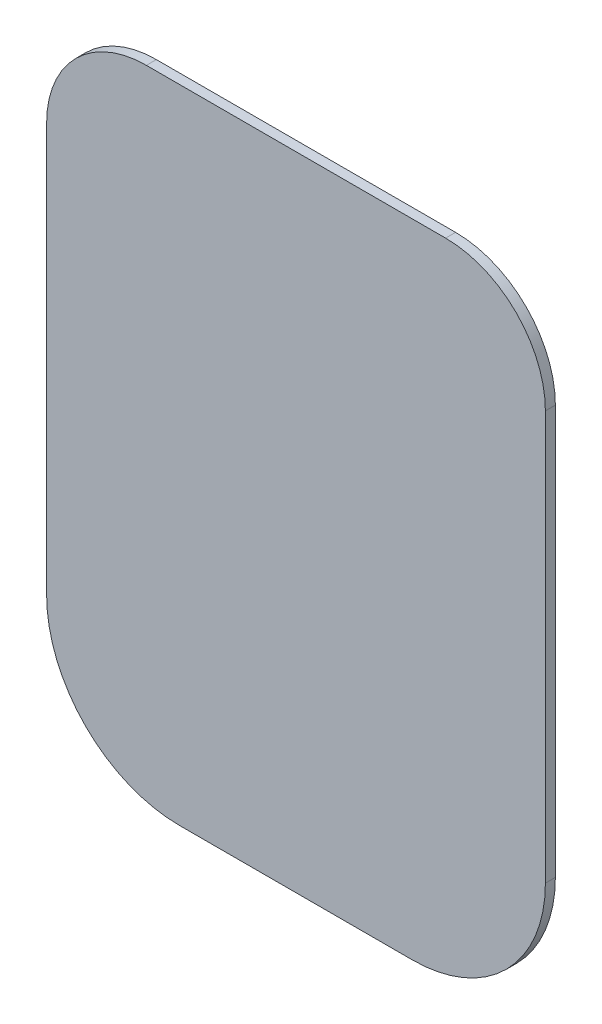
ISO-10303-21;
HEADER;
FILE_DESCRIPTION(('STEP AP214'),'2;1');
FILE_NAME('part.step','',(''),(''),'','','');
FILE_SCHEMA(('AUTOMOTIVE_DESIGN { 1 0 10303 214 1 1 1 1 }'));
ENDSEC;
DATA;
#1=APPLICATION_CONTEXT('core data for automotive mechanical design processes');
#2=APPLICATION_PROTOCOL_DEFINITION('international standard','automotive_design',2000,#1);
#3=PRODUCT_CONTEXT('',#1,'mechanical');
#4=PRODUCT('Part','Part','',(#3));
#5=PRODUCT_RELATED_PRODUCT_CATEGORY('part','',(#4));
#6=PRODUCT_DEFINITION_FORMATION('','',#4);
#7=PRODUCT_DEFINITION_CONTEXT('part definition',#1,'design');
#8=PRODUCT_DEFINITION('design','',#6,#7);
#9=PRODUCT_DEFINITION_SHAPE('','',#8);
#10=(LENGTH_UNIT() NAMED_UNIT(*) SI_UNIT(.MILLI.,.METRE.));
#11=(NAMED_UNIT(*) PLANE_ANGLE_UNIT() SI_UNIT($,.RADIAN.));
#12=(NAMED_UNIT(*) SI_UNIT($,.STERADIAN.) SOLID_ANGLE_UNIT());
#13=UNCERTAINTY_MEASURE_WITH_UNIT(LENGTH_MEASURE(1.E-05),#10,'distance_accuracy_value','');
#14=(GEOMETRIC_REPRESENTATION_CONTEXT(3) GLOBAL_UNCERTAINTY_ASSIGNED_CONTEXT((#13)) GLOBAL_UNIT_ASSIGNED_CONTEXT((#10,
#11,#12)) REPRESENTATION_CONTEXT('',''));
#15=CARTESIAN_POINT('',(0.,0.,0.));
#16=DIRECTION('',(0.,0.,1.));
#17=DIRECTION('',(1.,0.,0.));
#18=AXIS2_PLACEMENT_3D('',#15,#16,#17);
#19=CARTESIAN_POINT('',(-45.,66.5,3.));
#20=DIRECTION('',(0.,0.,-1.));
#21=DIRECTION('',(-1.,0.,0.));
#22=AXIS2_PLACEMENT_3D('',#19,#20,#21);
#23=CYLINDRICAL_SURFACE('',#22,30.);
#24=CARTESIAN_POINT('',(-45.,66.5,0.));
#25=DIRECTION('',(0.,0.,1.));
#26=DIRECTION('',(-1.,0.,0.));
#27=AXIS2_PLACEMENT_3D('',#24,#25,#26);
#28=CIRCLE('',#27,30.);
#29=CARTESIAN_POINT('',(-45.,96.5,0.));
#30=VERTEX_POINT('',#29);
#31=CARTESIAN_POINT('',(-75.,66.5,0.));
#32=VERTEX_POINT('',#31);
#33=EDGE_CURVE('E133',#30,#32,#28,.T.);
#34=ORIENTED_EDGE('',*,*,#33,.T.);
#35=DIRECTION('',(0.,0.,-1.));
#36=VECTOR('',#35,1.);
#37=CARTESIAN_POINT('',(-75.,66.5,3.));
#38=LINE('',#37,#36);
#39=CARTESIAN_POINT('',(-75.,66.5,3.));
#40=VERTEX_POINT('',#39);
#41=EDGE_CURVE('E11',#40,#32,#38,.T.);
#42=ORIENTED_EDGE('',*,*,#41,.F.);
#43=CARTESIAN_POINT('',(-45.,66.5,3.));
#44=DIRECTION('',(0.,0.,1.));
#45=DIRECTION('',(-1.,0.,0.));
#46=AXIS2_PLACEMENT_3D('',#43,#44,#45);
#47=CIRCLE('',#46,30.);
#48=CARTESIAN_POINT('',(-45.,96.5,3.));
#49=VERTEX_POINT('',#48);
#50=EDGE_CURVE('E148',#49,#40,#47,.T.);
#51=ORIENTED_EDGE('',*,*,#50,.F.);
#52=DIRECTION('',(0.,0.,-1.));
#53=VECTOR('',#52,1.);
#54=CARTESIAN_POINT('',(-45.,96.5,3.));
#55=LINE('',#54,#53);
#56=EDGE_CURVE('E129',#49,#30,#55,.T.);
#57=ORIENTED_EDGE('',*,*,#56,.T.);
#58=EDGE_LOOP('',(#34,#42,#51,#57));
#59=FACE_BOUND('',#58,.T.);
#60=ADVANCED_FACE('F37',(#59),#23,.T.);
#61=CARTESIAN_POINT('',(-75.,66.5,3.));
#62=DIRECTION('',(1.,0.,0.));
#63=DIRECTION('',(0.,1.,0.));
#64=AXIS2_PLACEMENT_3D('',#61,#62,#63);
#65=PLANE('',#64);
#66=DIRECTION('',(0.,-1.,0.));
#67=VECTOR('',#66,1.);
#68=CARTESIAN_POINT('',(-75.,66.5,0.));
#69=LINE('',#68,#67);
#70=CARTESIAN_POINT('',(-75.,-56.5,0.));
#71=VERTEX_POINT('',#70);
#72=EDGE_CURVE('E136',#32,#71,#69,.T.);
#73=ORIENTED_EDGE('',*,*,#72,.T.);
#74=DIRECTION('',(0.,0.,-1.));
#75=VECTOR('',#74,1.);
#76=CARTESIAN_POINT('',(-75.,-56.5,3.));
#77=LINE('',#76,#75);
#78=CARTESIAN_POINT('',(-75.,-56.5,3.));
#79=VERTEX_POINT('',#78);
#80=EDGE_CURVE('E45',#79,#71,#77,.T.);
#81=ORIENTED_EDGE('',*,*,#80,.F.);
#82=DIRECTION('',(0.,-1.,0.));
#83=VECTOR('',#82,1.);
#84=CARTESIAN_POINT('',(-75.,66.5,3.));
#85=LINE('',#84,#83);
#86=EDGE_CURVE('E96',#40,#79,#85,.T.);
#87=ORIENTED_EDGE('',*,*,#86,.F.);
#88=ORIENTED_EDGE('',*,*,#41,.T.);
#89=EDGE_LOOP('',(#73,#81,#87,#88));
#90=FACE_BOUND('',#89,.T.);
#91=ADVANCED_FACE('F182',(#90),#65,.F.);
#92=CARTESIAN_POINT('',(-35.,-56.5,3.));
#93=DIRECTION('',(0.,0.,-1.));
#94=DIRECTION('',(-1.,0.,0.));
#95=AXIS2_PLACEMENT_3D('',#92,#93,#94);
#96=CYLINDRICAL_SURFACE('',#95,40.);
#97=CARTESIAN_POINT('',(-35.,-56.5,0.));
#98=DIRECTION('',(0.,0.,1.));
#99=DIRECTION('',(1.,0.,0.));
#100=AXIS2_PLACEMENT_3D('',#97,#98,#99);
#101=CIRCLE('',#100,40.);
#102=CARTESIAN_POINT('',(-35.,-96.5,0.));
#103=VERTEX_POINT('',#102);
#104=EDGE_CURVE('E138',#71,#103,#101,.T.);
#105=ORIENTED_EDGE('',*,*,#104,.T.);
#106=DIRECTION('',(0.,0.,-1.));
#107=VECTOR('',#106,1.);
#108=CARTESIAN_POINT('',(-35.,-96.5,3.));
#109=LINE('',#108,#107);
#110=CARTESIAN_POINT('',(-35.,-96.5,3.));
#111=VERTEX_POINT('',#110);
#112=EDGE_CURVE('E155',#111,#103,#109,.T.);
#113=ORIENTED_EDGE('',*,*,#112,.F.);
#114=CARTESIAN_POINT('',(-35.,-56.5,3.));
#115=DIRECTION('',(0.,0.,1.));
#116=DIRECTION('',(1.,0.,0.));
#117=AXIS2_PLACEMENT_3D('',#114,#115,#116);
#118=CIRCLE('',#117,40.);
#119=EDGE_CURVE('E163',#79,#111,#118,.T.);
#120=ORIENTED_EDGE('',*,*,#119,.F.);
#121=ORIENTED_EDGE('',*,*,#80,.T.);
#122=EDGE_LOOP('',(#105,#113,#120,#121));
#123=FACE_BOUND('',#122,.T.);
#124=ADVANCED_FACE('F161',(#123),#96,.T.);
#125=CARTESIAN_POINT('',(0.500000000000024,-96.5,3.));
#126=DIRECTION('',(0.,1.,0.));
#127=DIRECTION('',(0.,0.,1.));
#128=AXIS2_PLACEMENT_3D('',#125,#126,#127);
#129=PLANE('',#128);
#130=DIRECTION('',(1.,0.,0.));
#131=VECTOR('',#130,1.);
#132=CARTESIAN_POINT('',(0.500000000000024,-96.5,0.));
#133=LINE('',#132,#131);
#134=CARTESIAN_POINT('',(35.,-96.5,0.));
#135=VERTEX_POINT('',#134);
#136=EDGE_CURVE('E141',#103,#135,#133,.T.);
#137=ORIENTED_EDGE('',*,*,#136,.T.);
#138=DIRECTION('',(0.,0.,-1.));
#139=VECTOR('',#138,1.);
#140=CARTESIAN_POINT('',(35.,-96.5,3.));
#141=LINE('',#140,#139);
#142=CARTESIAN_POINT('',(35.,-96.5,3.));
#143=VERTEX_POINT('',#142);
#144=EDGE_CURVE('E152',#143,#135,#141,.T.);
#145=ORIENTED_EDGE('',*,*,#144,.F.);
#146=DIRECTION('',(1.,0.,0.));
#147=VECTOR('',#146,1.);
#148=CARTESIAN_POINT('',(-35.,-96.5,3.));
#149=LINE('',#148,#147);
#150=EDGE_CURVE('E174',#111,#143,#149,.T.);
#151=ORIENTED_EDGE('',*,*,#150,.F.);
#152=ORIENTED_EDGE('',*,*,#112,.T.);
#153=EDGE_LOOP('',(#137,#145,#151,#152));
#154=FACE_BOUND('',#153,.T.);
#155=ADVANCED_FACE('F170',(#154),#129,.F.);
#156=CARTESIAN_POINT('',(35.,-56.5,3.));
#157=DIRECTION('',(0.,0.,-1.));
#158=DIRECTION('',(-1.,0.,0.));
#159=AXIS2_PLACEMENT_3D('',#156,#157,#158);
#160=CYLINDRICAL_SURFACE('',#159,40.);
#161=CARTESIAN_POINT('',(35.,-56.5,0.));
#162=DIRECTION('',(0.,0.,1.));
#163=DIRECTION('',(1.,0.,0.));
#164=AXIS2_PLACEMENT_3D('',#161,#162,#163);
#165=CIRCLE('',#164,40.);
#166=CARTESIAN_POINT('',(75.,-56.5,0.));
#167=VERTEX_POINT('',#166);
#168=EDGE_CURVE('E143',#135,#167,#165,.T.);
#169=ORIENTED_EDGE('',*,*,#168,.T.);
#170=DIRECTION('',(0.,0.,-1.));
#171=VECTOR('',#170,1.);
#172=CARTESIAN_POINT('',(75.,-56.5,3.));
#173=LINE('',#172,#171);
#174=CARTESIAN_POINT('',(75.,-56.5,3.));
#175=VERTEX_POINT('',#174);
#176=EDGE_CURVE('E124',#175,#167,#173,.T.);
#177=ORIENTED_EDGE('',*,*,#176,.F.);
#178=CARTESIAN_POINT('',(35.,-56.5,3.));
#179=DIRECTION('',(0.,0.,1.));
#180=DIRECTION('',(1.,0.,0.));
#181=AXIS2_PLACEMENT_3D('',#178,#179,#180);
#182=CIRCLE('',#181,40.);
#183=EDGE_CURVE('E115',#143,#175,#182,.T.);
#184=ORIENTED_EDGE('',*,*,#183,.F.);
#185=ORIENTED_EDGE('',*,*,#144,.T.);
#186=EDGE_LOOP('',(#169,#177,#184,#185));
#187=FACE_BOUND('',#186,.T.);
#188=ADVANCED_FACE('F173',(#187),#160,.T.);
#189=CARTESIAN_POINT('',(75.,66.5,3.));
#190=DIRECTION('',(-1.,0.,0.));
#191=DIRECTION('',(0.,-1.,0.));
#192=AXIS2_PLACEMENT_3D('',#189,#190,#191);
#193=PLANE('',#192);
#194=DIRECTION('',(0.,1.,0.));
#195=VECTOR('',#194,1.);
#196=CARTESIAN_POINT('',(75.,66.5,0.));
#197=LINE('',#196,#195);
#198=CARTESIAN_POINT('',(75.,66.5,0.));
#199=VERTEX_POINT('',#198);
#200=EDGE_CURVE('E123',#167,#199,#197,.T.);
#201=ORIENTED_EDGE('',*,*,#200,.T.);
#202=DIRECTION('',(0.,0.,-1.));
#203=VECTOR('',#202,1.);
#204=CARTESIAN_POINT('',(75.,66.5,3.));
#205=LINE('',#204,#203);
#206=CARTESIAN_POINT('',(75.,66.5,3.));
#207=VERTEX_POINT('',#206);
#208=EDGE_CURVE('E120',#207,#199,#205,.T.);
#209=ORIENTED_EDGE('',*,*,#208,.F.);
#210=DIRECTION('',(0.,1.,0.));
#211=VECTOR('',#210,1.);
#212=CARTESIAN_POINT('',(75.,66.5,3.));
#213=LINE('',#212,#211);
#214=EDGE_CURVE('E109',#175,#207,#213,.T.);
#215=ORIENTED_EDGE('',*,*,#214,.F.);
#216=ORIENTED_EDGE('',*,*,#176,.T.);
#217=EDGE_LOOP('',(#201,#209,#215,#216));
#218=FACE_BOUND('',#217,.T.);
#219=ADVANCED_FACE('F121',(#218),#193,.F.);
#220=CARTESIAN_POINT('',(45.,66.5,3.));
#221=DIRECTION('',(0.,0.,-1.));
#222=DIRECTION('',(-1.,0.,0.));
#223=AXIS2_PLACEMENT_3D('',#220,#221,#222);
#224=CYLINDRICAL_SURFACE('',#223,30.);
#225=CARTESIAN_POINT('',(45.,66.5,0.));
#226=DIRECTION('',(0.,0.,1.));
#227=DIRECTION('',(-1.,0.,0.));
#228=AXIS2_PLACEMENT_3D('',#225,#226,#227);
#229=CIRCLE('',#228,30.);
#230=CARTESIAN_POINT('',(45.,96.5,0.));
#231=VERTEX_POINT('',#230);
#232=EDGE_CURVE('E82',#199,#231,#229,.T.);
#233=ORIENTED_EDGE('',*,*,#232,.T.);
#234=DIRECTION('',(0.,0.,-1.));
#235=VECTOR('',#234,1.);
#236=CARTESIAN_POINT('',(45.,96.5,3.));
#237=LINE('',#236,#235);
#238=CARTESIAN_POINT('',(45.,96.5,3.));
#239=VERTEX_POINT('',#238);
#240=EDGE_CURVE('E125',#239,#231,#237,.T.);
#241=ORIENTED_EDGE('',*,*,#240,.F.);
#242=CARTESIAN_POINT('',(45.,66.5,3.));
#243=DIRECTION('',(0.,0.,1.));
#244=DIRECTION('',(-1.,0.,0.));
#245=AXIS2_PLACEMENT_3D('',#242,#243,#244);
#246=CIRCLE('',#245,30.);
#247=EDGE_CURVE('E113',#207,#239,#246,.T.);
#248=ORIENTED_EDGE('',*,*,#247,.F.);
#249=ORIENTED_EDGE('',*,*,#208,.T.);
#250=EDGE_LOOP('',(#233,#241,#248,#249));
#251=FACE_BOUND('',#250,.T.);
#252=ADVANCED_FACE('F127',(#251),#224,.T.);
#253=CARTESIAN_POINT('',(-45.,96.5,3.));
#254=DIRECTION('',(0.,-1.,0.));
#255=DIRECTION('',(1.,0.,0.));
#256=AXIS2_PLACEMENT_3D('',#253,#254,#255);
#257=PLANE('',#256);
#258=DIRECTION('',(-1.,0.,0.));
#259=VECTOR('',#258,1.);
#260=CARTESIAN_POINT('',(-45.,96.5,0.));
#261=LINE('',#260,#259);
#262=EDGE_CURVE('E88',#231,#30,#261,.T.);
#263=ORIENTED_EDGE('',*,*,#262,.T.);
#264=ORIENTED_EDGE('',*,*,#56,.F.);
#265=DIRECTION('',(-1.,0.,0.));
#266=VECTOR('',#265,1.);
#267=CARTESIAN_POINT('',(-45.,96.5,3.));
#268=LINE('',#267,#266);
#269=EDGE_CURVE('E53',#239,#49,#268,.T.);
#270=ORIENTED_EDGE('',*,*,#269,.F.);
#271=ORIENTED_EDGE('',*,*,#240,.T.);
#272=EDGE_LOOP('',(#263,#264,#270,#271));
#273=FACE_BOUND('',#272,.T.);
#274=ADVANCED_FACE('F198',(#273),#257,.F.);
#275=CARTESIAN_POINT('',(-45.,66.5,3.));
#276=DIRECTION('',(0.,0.,-1.));
#277=DIRECTION('',(-1.,0.,0.));
#278=AXIS2_PLACEMENT_3D('',#275,#276,#277);
#279=PLANE('',#278);
#280=ORIENTED_EDGE('',*,*,#50,.T.);
#281=ORIENTED_EDGE('',*,*,#86,.T.);
#282=ORIENTED_EDGE('',*,*,#119,.T.);
#283=ORIENTED_EDGE('',*,*,#150,.T.);
#284=ORIENTED_EDGE('',*,*,#183,.T.);
#285=ORIENTED_EDGE('',*,*,#214,.T.);
#286=ORIENTED_EDGE('',*,*,#247,.T.);
#287=ORIENTED_EDGE('',*,*,#269,.T.);
#288=EDGE_LOOP('',(#280,#281,#282,#283,#284,#285,#286,#287));
#289=FACE_BOUND('',#288,.T.);
#290=ADVANCED_FACE('F111',(#289),#279,.F.);
#291=CARTESIAN_POINT('',(-45.,66.5,0.));
#292=DIRECTION('',(0.,0.,-1.));
#293=DIRECTION('',(-1.,0.,0.));
#294=AXIS2_PLACEMENT_3D('',#291,#292,#293);
#295=PLANE('',#294);
#296=ORIENTED_EDGE('',*,*,#33,.F.);
#297=ORIENTED_EDGE('',*,*,#262,.F.);
#298=ORIENTED_EDGE('',*,*,#232,.F.);
#299=ORIENTED_EDGE('',*,*,#200,.F.);
#300=ORIENTED_EDGE('',*,*,#168,.F.);
#301=ORIENTED_EDGE('',*,*,#136,.F.);
#302=ORIENTED_EDGE('',*,*,#104,.F.);
#303=ORIENTED_EDGE('',*,*,#72,.F.);
#304=EDGE_LOOP('',(#296,#297,#298,#299,#300,#301,#302,#303));
#305=FACE_BOUND('',#304,.T.);
#306=ADVANCED_FACE('F166',(#305),#295,.T.);
#307=CLOSED_SHELL('',(#60,#91,#124,#155,#188,#219,#252,#274,#290,#306));
#308=MANIFOLD_SOLID_BREP('B2',#307);
#309=ADVANCED_BREP_SHAPE_REPRESENTATION('',(#18,#308),#14);
#310=SHAPE_DEFINITION_REPRESENTATION(#9,#309);
ENDSEC;
END-ISO-10303-21;
